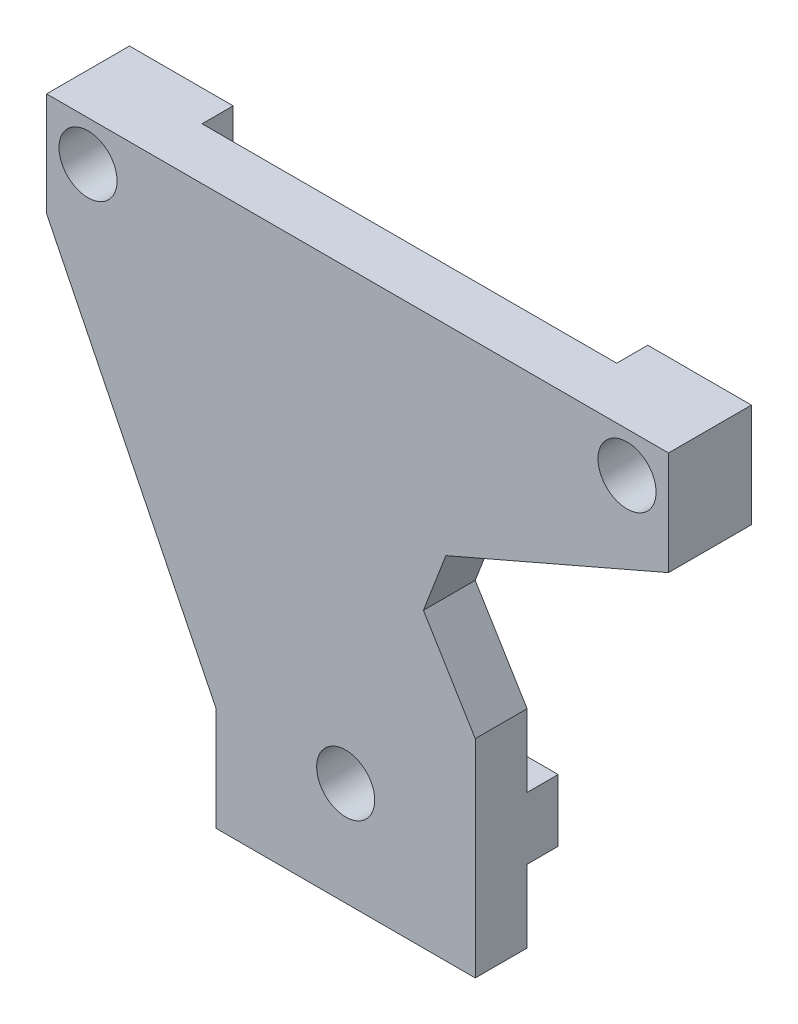
ISO-10303-21;
HEADER;
FILE_DESCRIPTION(('STEP AP214'),'2;1');
FILE_NAME('part.step','',(''),(''),'','','');
FILE_SCHEMA(('AUTOMOTIVE_DESIGN { 1 0 10303 214 1 1 1 1 }'));
ENDSEC;
DATA;
#1=APPLICATION_CONTEXT('core data for automotive mechanical design processes');
#2=APPLICATION_PROTOCOL_DEFINITION('international standard','automotive_design',2000,#1);
#3=PRODUCT_CONTEXT('',#1,'mechanical');
#4=PRODUCT('Part','Part','',(#3));
#5=PRODUCT_RELATED_PRODUCT_CATEGORY('part','',(#4));
#6=PRODUCT_DEFINITION_FORMATION('','',#4);
#7=PRODUCT_DEFINITION_CONTEXT('part definition',#1,'design');
#8=PRODUCT_DEFINITION('design','',#6,#7);
#9=PRODUCT_DEFINITION_SHAPE('','',#8);
#10=(LENGTH_UNIT() NAMED_UNIT(*) SI_UNIT(.MILLI.,.METRE.));
#11=(NAMED_UNIT(*) PLANE_ANGLE_UNIT() SI_UNIT($,.RADIAN.));
#12=(NAMED_UNIT(*) SI_UNIT($,.STERADIAN.) SOLID_ANGLE_UNIT());
#13=UNCERTAINTY_MEASURE_WITH_UNIT(LENGTH_MEASURE(1.E-05),#10,'distance_accuracy_value','');
#14=(GEOMETRIC_REPRESENTATION_CONTEXT(3) GLOBAL_UNCERTAINTY_ASSIGNED_CONTEXT((#13)) GLOBAL_UNIT_ASSIGNED_CONTEXT((#10,
#11,#12)) REPRESENTATION_CONTEXT('',''));
#15=CARTESIAN_POINT('',(0.,0.,0.));
#16=DIRECTION('',(0.,0.,1.));
#17=DIRECTION('',(1.,0.,0.));
#18=AXIS2_PLACEMENT_3D('',#15,#16,#17);
#19=CARTESIAN_POINT('',(0.,0.,0.));
#20=DIRECTION('',(0.,0.,1.));
#21=DIRECTION('',(1.,0.,0.));
#22=AXIS2_PLACEMENT_3D('',#19,#20,#21);
#23=PLANE('',#22);
#24=DIRECTION('',(0.442079053201817,-0.896976092613502,0.));
#25=VECTOR('',#24,1.);
#26=CARTESIAN_POINT('',(0.,-10.,0.));
#27=LINE('',#26,#25);
#28=CARTESIAN_POINT('',(0.,-10.,0.));
#29=VERTEX_POINT('',#28);
#30=CARTESIAN_POINT('',(16.3569249684672,-43.1881154266996,0.));
#31=VERTEX_POINT('',#30);
#32=EDGE_CURVE('E155',#29,#31,#27,.T.);
#33=ORIENTED_EDGE('',*,*,#32,.F.);
#34=DIRECTION('',(1.,0.,0.));
#35=VECTOR('',#34,1.);
#36=CARTESIAN_POINT('',(0.,-10.,0.));
#37=LINE('',#36,#35);
#38=CARTESIAN_POINT('',(10.,-10.,0.));
#39=VERTEX_POINT('',#38);
#40=EDGE_CURVE('E227',#29,#39,#37,.T.);
#41=ORIENTED_EDGE('',*,*,#40,.T.);
#42=DIRECTION('',(0.,-1.,0.));
#43=VECTOR('',#42,1.);
#44=CARTESIAN_POINT('',(10.,0.,0.));
#45=LINE('',#44,#43);
#46=CARTESIAN_POINT('',(10.,0.,0.));
#47=VERTEX_POINT('',#46);
#48=EDGE_CURVE('E465',#47,#39,#45,.T.);
#49=ORIENTED_EDGE('',*,*,#48,.F.);
#50=DIRECTION('',(-1.,0.,0.));
#51=VECTOR('',#50,1.);
#52=CARTESIAN_POINT('',(0.,0.,0.));
#53=LINE('',#52,#51);
#54=CARTESIAN_POINT('',(50.,0.,0.));
#55=VERTEX_POINT('',#54);
#56=EDGE_CURVE('E178',#55,#47,#53,.T.);
#57=ORIENTED_EDGE('',*,*,#56,.F.);
#58=DIRECTION('',(0.,-1.,0.));
#59=VECTOR('',#58,1.);
#60=CARTESIAN_POINT('',(50.,0.,0.));
#61=LINE('',#60,#59);
#62=CARTESIAN_POINT('',(50.,-10.,0.));
#63=VERTEX_POINT('',#62);
#64=EDGE_CURVE('E348',#55,#63,#61,.T.);
#65=ORIENTED_EDGE('',*,*,#64,.T.);
#66=DIRECTION('',(-1.,0.,0.));
#67=VECTOR('',#66,1.);
#68=CARTESIAN_POINT('',(60.,-10.,0.));
#69=LINE('',#68,#67);
#70=CARTESIAN_POINT('',(60.,-10.,0.));
#71=VERTEX_POINT('',#70);
#72=EDGE_CURVE('E301',#71,#63,#69,.T.);
#73=ORIENTED_EDGE('',*,*,#72,.F.);
#74=DIRECTION('',(0.917432042877984,0.397892506464659,0.));
#75=VECTOR('',#74,1.);
#76=CARTESIAN_POINT('',(38.5227399227401,-19.3147398877922,0.));
#77=LINE('',#76,#75);
#78=CARTESIAN_POINT('',(38.5227399227401,-19.3147398877922,0.));
#79=VERTEX_POINT('',#78);
#80=EDGE_CURVE('E138',#79,#71,#77,.T.);
#81=ORIENTED_EDGE('',*,*,#80,.F.);
#82=DIRECTION('',(0.357936011632452,0.93374611730205,0.));
#83=VECTOR('',#82,1.);
#84=CARTESIAN_POINT('',(36.3557169880903,-24.9678431955744,0.));
#85=LINE('',#84,#83);
#86=CARTESIAN_POINT('',(36.3557169880903,-24.9678431955744,0.));
#87=VERTEX_POINT('',#86);
#88=EDGE_CURVE('E92',#87,#79,#85,.T.);
#89=ORIENTED_EDGE('',*,*,#88,.F.);
#90=DIRECTION('',(-0.519762211169417,0.854310976073864,0.));
#91=VECTOR('',#90,1.);
#92=CARTESIAN_POINT('',(41.3569249684672,-33.1881154266996,0.));
#93=LINE('',#92,#91);
#94=CARTESIAN_POINT('',(41.3569249684672,-33.1881154266996,0.));
#95=VERTEX_POINT('',#94);
#96=EDGE_CURVE('E171',#95,#87,#93,.T.);
#97=ORIENTED_EDGE('',*,*,#96,.F.);
#98=DIRECTION('',(0.,1.,0.));
#99=VECTOR('',#98,1.);
#100=CARTESIAN_POINT('',(41.3569249684672,-53.1881154266996,0.));
#101=LINE('',#100,#99);
#102=CARTESIAN_POINT('',(41.3569249684672,-40.1881154266996,0.));
#103=VERTEX_POINT('',#102);
#104=EDGE_CURVE('E166',#103,#95,#101,.T.);
#105=ORIENTED_EDGE('',*,*,#104,.F.);
#106=DIRECTION('',(-1.,0.,0.));
#107=VECTOR('',#106,1.);
#108=CARTESIAN_POINT('',(41.3569249684672,-40.1881154266996,0.));
#109=LINE('',#108,#107);
#110=CARTESIAN_POINT('',(16.3569249684672,-40.1881154266996,0.));
#111=VERTEX_POINT('',#110);
#112=EDGE_CURVE('E374',#103,#111,#109,.T.);
#113=ORIENTED_EDGE('',*,*,#112,.T.);
#114=DIRECTION('',(0.,-1.,0.));
#115=VECTOR('',#114,1.);
#116=CARTESIAN_POINT('',(16.3569249684672,-40.1881154266996,0.));
#117=LINE('',#116,#115);
#118=EDGE_CURVE('E213',#111,#31,#117,.T.);
#119=ORIENTED_EDGE('',*,*,#118,.T.);
#120=EDGE_LOOP('',(#33,#41,#49,#57,#65,#73,#81,#89,#97,#105,#113,#119));
#121=FACE_BOUND('',#120,.T.);
#122=ADVANCED_FACE('F42',(#121),#23,.F.);
#123=DIRECTION('',(-1.,0.,0.));
#124=VECTOR('',#123,1.);
#125=CARTESIAN_POINT('',(41.3569249684672,-46.1881154266996,0.));
#126=LINE('',#125,#124);
#127=CARTESIAN_POINT('',(41.3569249684672,-46.1881154266996,0.));
#128=VERTEX_POINT('',#127);
#129=CARTESIAN_POINT('',(16.3569249684672,-46.1881154266996,0.));
#130=VERTEX_POINT('',#129);
#131=EDGE_CURVE('E58',#128,#130,#126,.T.);
#132=ORIENTED_EDGE('',*,*,#131,.F.);
#133=CARTESIAN_POINT('',(41.3569249684672,-53.1881154266996,0.));
#134=VERTEX_POINT('',#133);
#135=EDGE_CURVE('E167',#134,#128,#101,.T.);
#136=ORIENTED_EDGE('',*,*,#135,.F.);
#137=DIRECTION('',(1.,0.,0.));
#138=VECTOR('',#137,1.);
#139=CARTESIAN_POINT('',(16.3569249684672,-53.1881154266996,0.));
#140=LINE('',#139,#138);
#141=CARTESIAN_POINT('',(16.3569249684672,-53.1881154266996,0.));
#142=VERTEX_POINT('',#141);
#143=EDGE_CURVE('E163',#142,#134,#140,.T.);
#144=ORIENTED_EDGE('',*,*,#143,.F.);
#145=DIRECTION('',(0.,-1.,0.));
#146=VECTOR('',#145,1.);
#147=CARTESIAN_POINT('',(16.3569249684672,-43.1881154266996,0.));
#148=LINE('',#147,#146);
#149=EDGE_CURVE('E159',#130,#142,#148,.T.);
#150=ORIENTED_EDGE('',*,*,#149,.F.);
#151=EDGE_LOOP('',(#132,#136,#144,#150));
#152=FACE_BOUND('',#151,.T.);
#153=ADVANCED_FACE('F298',(#152),#23,.F.);
#154=CARTESIAN_POINT('',(0.,0.,5.));
#155=DIRECTION('',(1.,0.,0.));
#156=DIRECTION('',(0.,0.,-1.));
#157=AXIS2_PLACEMENT_3D('',#154,#155,#156);
#158=PLANE('',#157);
#159=DIRECTION('',(0.,0.,-1.));
#160=VECTOR('',#159,1.);
#161=CARTESIAN_POINT('',(0.,0.,5.));
#162=LINE('',#161,#160);
#163=CARTESIAN_POINT('',(0.,0.,5.));
#164=VERTEX_POINT('',#163);
#165=CARTESIAN_POINT('',(0.,0.,-3.));
#166=VERTEX_POINT('',#165);
#167=EDGE_CURVE('E151',#164,#166,#162,.T.);
#168=ORIENTED_EDGE('',*,*,#167,.T.);
#169=DIRECTION('',(0.,-1.,0.));
#170=VECTOR('',#169,1.);
#171=CARTESIAN_POINT('',(0.,0.,-3.));
#172=LINE('',#171,#170);
#173=CARTESIAN_POINT('',(0.,-10.,-3.));
#174=VERTEX_POINT('',#173);
#175=EDGE_CURVE('E440',#166,#174,#172,.T.);
#176=ORIENTED_EDGE('',*,*,#175,.T.);
#177=DIRECTION('',(0.,0.,1.));
#178=VECTOR('',#177,1.);
#179=CARTESIAN_POINT('',(0.,-10.,-3.));
#180=LINE('',#179,#178);
#181=EDGE_CURVE('E235',#174,#29,#180,.T.);
#182=ORIENTED_EDGE('',*,*,#181,.T.);
#183=DIRECTION('',(0.,0.,-1.));
#184=VECTOR('',#183,1.);
#185=CARTESIAN_POINT('',(0.,-10.,5.));
#186=LINE('',#185,#184);
#187=CARTESIAN_POINT('',(0.,-10.,5.));
#188=VERTEX_POINT('',#187);
#189=EDGE_CURVE('E12',#188,#29,#186,.T.);
#190=ORIENTED_EDGE('',*,*,#189,.F.);
#191=DIRECTION('',(0.,-1.,0.));
#192=VECTOR('',#191,1.);
#193=CARTESIAN_POINT('',(0.,0.,5.));
#194=LINE('',#193,#192);
#195=EDGE_CURVE('E182',#164,#188,#194,.T.);
#196=ORIENTED_EDGE('',*,*,#195,.F.);
#197=EDGE_LOOP('',(#168,#176,#182,#190,#196));
#198=FACE_BOUND('',#197,.T.);
#199=ADVANCED_FACE('F44',(#198),#158,.F.);
#200=CARTESIAN_POINT('',(0.,-10.,5.));
#201=DIRECTION('',(0.896976092613502,0.442079053201817,0.));
#202=DIRECTION('',(-0.442079053201817,0.896976092613502,0.));
#203=AXIS2_PLACEMENT_3D('',#200,#201,#202);
#204=PLANE('',#203);
#205=ORIENTED_EDGE('',*,*,#32,.T.);
#206=DIRECTION('',(0.,0.,-1.));
#207=VECTOR('',#206,1.);
#208=CARTESIAN_POINT('',(16.3569249684672,-43.1881154266996,5.));
#209=LINE('',#208,#207);
#210=CARTESIAN_POINT('',(16.3569249684672,-43.1881154266996,5.));
#211=VERTEX_POINT('',#210);
#212=EDGE_CURVE('E51',#211,#31,#209,.T.);
#213=ORIENTED_EDGE('',*,*,#212,.F.);
#214=DIRECTION('',(0.442079053201817,-0.896976092613502,0.));
#215=VECTOR('',#214,1.);
#216=CARTESIAN_POINT('',(0.,-10.,5.));
#217=LINE('',#216,#215);
#218=EDGE_CURVE('E100',#188,#211,#217,.T.);
#219=ORIENTED_EDGE('',*,*,#218,.F.);
#220=ORIENTED_EDGE('',*,*,#189,.T.);
#221=EDGE_LOOP('',(#205,#213,#219,#220));
#222=FACE_BOUND('',#221,.T.);
#223=ADVANCED_FACE('F218',(#222),#204,.F.);
#224=CARTESIAN_POINT('',(16.3569249684672,-43.1881154266996,5.));
#225=DIRECTION('',(1.,0.,0.));
#226=DIRECTION('',(0.,0.,-1.));
#227=AXIS2_PLACEMENT_3D('',#224,#225,#226);
#228=PLANE('',#227);
#229=ORIENTED_EDGE('',*,*,#212,.T.);
#230=ORIENTED_EDGE('',*,*,#118,.F.);
#231=DIRECTION('',(0.,0.,1.));
#232=VECTOR('',#231,1.);
#233=CARTESIAN_POINT('',(16.3569249684672,-40.1881154266996,-3.));
#234=LINE('',#233,#232);
#235=CARTESIAN_POINT('',(16.3569249684672,-40.1881154266996,-3.));
#236=VERTEX_POINT('',#235);
#237=EDGE_CURVE('E316',#236,#111,#234,.T.);
#238=ORIENTED_EDGE('',*,*,#237,.F.);
#239=DIRECTION('',(0.,-1.,0.));
#240=VECTOR('',#239,1.);
#241=CARTESIAN_POINT('',(16.3569249684672,-40.1881154266996,-3.));
#242=LINE('',#241,#240);
#243=CARTESIAN_POINT('',(16.3569249684672,-46.1881154266996,-3.));
#244=VERTEX_POINT('',#243);
#245=EDGE_CURVE('E314',#236,#244,#242,.T.);
#246=ORIENTED_EDGE('',*,*,#245,.T.);
#247=DIRECTION('',(0.,0.,1.));
#248=VECTOR('',#247,1.);
#249=CARTESIAN_POINT('',(16.3569249684672,-46.1881154266996,-3.));
#250=LINE('',#249,#248);
#251=EDGE_CURVE('E160',#244,#130,#250,.T.);
#252=ORIENTED_EDGE('',*,*,#251,.T.);
#253=ORIENTED_EDGE('',*,*,#149,.T.);
#254=DIRECTION('',(0.,0.,-1.));
#255=VECTOR('',#254,1.);
#256=CARTESIAN_POINT('',(16.3569249684672,-53.1881154266996,5.));
#257=LINE('',#256,#255);
#258=CARTESIAN_POINT('',(16.3569249684672,-53.1881154266996,5.));
#259=VERTEX_POINT('',#258);
#260=EDGE_CURVE('E201',#259,#142,#257,.T.);
#261=ORIENTED_EDGE('',*,*,#260,.F.);
#262=DIRECTION('',(0.,-1.,0.));
#263=VECTOR('',#262,1.);
#264=CARTESIAN_POINT('',(16.3569249684672,-43.1881154266996,5.));
#265=LINE('',#264,#263);
#266=EDGE_CURVE('E216',#211,#259,#265,.T.);
#267=ORIENTED_EDGE('',*,*,#266,.F.);
#268=EDGE_LOOP('',(#229,#230,#238,#246,#252,#253,#261,#267));
#269=FACE_BOUND('',#268,.T.);
#270=ADVANCED_FACE('F209',(#269),#228,.F.);
#271=CARTESIAN_POINT('',(16.3569249684672,-53.1881154266996,5.));
#272=DIRECTION('',(0.,1.,0.));
#273=DIRECTION('',(0.,0.,1.));
#274=AXIS2_PLACEMENT_3D('',#271,#272,#273);
#275=PLANE('',#274);
#276=ORIENTED_EDGE('',*,*,#143,.T.);
#277=DIRECTION('',(0.,0.,-1.));
#278=VECTOR('',#277,1.);
#279=CARTESIAN_POINT('',(41.3569249684672,-53.1881154266996,5.));
#280=LINE('',#279,#278);
#281=CARTESIAN_POINT('',(41.3569249684672,-53.1881154266996,5.));
#282=VERTEX_POINT('',#281);
#283=EDGE_CURVE('E197',#282,#134,#280,.T.);
#284=ORIENTED_EDGE('',*,*,#283,.F.);
#285=DIRECTION('',(1.,0.,0.));
#286=VECTOR('',#285,1.);
#287=CARTESIAN_POINT('',(16.3569249684672,-53.1881154266996,5.));
#288=LINE('',#287,#286);
#289=EDGE_CURVE('E311',#259,#282,#288,.T.);
#290=ORIENTED_EDGE('',*,*,#289,.F.);
#291=ORIENTED_EDGE('',*,*,#260,.T.);
#292=EDGE_LOOP('',(#276,#284,#290,#291));
#293=FACE_BOUND('',#292,.T.);
#294=ADVANCED_FACE('F310',(#293),#275,.F.);
#295=CARTESIAN_POINT('',(41.3569249684672,-53.1881154266996,5.));
#296=DIRECTION('',(-1.,0.,0.));
#297=DIRECTION('',(0.,0.,1.));
#298=AXIS2_PLACEMENT_3D('',#295,#296,#297);
#299=PLANE('',#298);
#300=ORIENTED_EDGE('',*,*,#135,.T.);
#301=DIRECTION('',(0.,0.,1.));
#302=VECTOR('',#301,1.);
#303=CARTESIAN_POINT('',(41.3569249684672,-46.1881154266996,-3.));
#304=LINE('',#303,#302);
#305=CARTESIAN_POINT('',(41.3569249684672,-46.1881154266996,-3.));
#306=VERTEX_POINT('',#305);
#307=EDGE_CURVE('E286',#306,#128,#304,.T.);
#308=ORIENTED_EDGE('',*,*,#307,.F.);
#309=DIRECTION('',(0.,-1.,0.));
#310=VECTOR('',#309,1.);
#311=CARTESIAN_POINT('',(41.3569249684672,-40.1881154266996,-3.));
#312=LINE('',#311,#310);
#313=CARTESIAN_POINT('',(41.3569249684672,-40.1881154266996,-3.));
#314=VERTEX_POINT('',#313);
#315=EDGE_CURVE('E293',#314,#306,#312,.T.);
#316=ORIENTED_EDGE('',*,*,#315,.F.);
#317=DIRECTION('',(0.,0.,1.));
#318=VECTOR('',#317,1.);
#319=CARTESIAN_POINT('',(41.3569249684672,-40.1881154266996,-3.));
#320=LINE('',#319,#318);
#321=EDGE_CURVE('E292',#314,#103,#320,.T.);
#322=ORIENTED_EDGE('',*,*,#321,.T.);
#323=ORIENTED_EDGE('',*,*,#104,.T.);
#324=DIRECTION('',(0.,0.,-1.));
#325=VECTOR('',#324,1.);
#326=CARTESIAN_POINT('',(41.3569249684672,-33.1881154266996,5.));
#327=LINE('',#326,#325);
#328=CARTESIAN_POINT('',(41.3569249684672,-33.1881154266996,5.));
#329=VERTEX_POINT('',#328);
#330=EDGE_CURVE('E193',#329,#95,#327,.T.);
#331=ORIENTED_EDGE('',*,*,#330,.F.);
#332=DIRECTION('',(0.,1.,0.));
#333=VECTOR('',#332,1.);
#334=CARTESIAN_POINT('',(41.3569249684672,-53.1881154266996,5.));
#335=LINE('',#334,#333);
#336=EDGE_CURVE('E307',#282,#329,#335,.T.);
#337=ORIENTED_EDGE('',*,*,#336,.F.);
#338=ORIENTED_EDGE('',*,*,#283,.T.);
#339=EDGE_LOOP('',(#300,#308,#316,#322,#323,#331,#337,#338));
#340=FACE_BOUND('',#339,.T.);
#341=ADVANCED_FACE('F303',(#340),#299,.F.);
#342=CARTESIAN_POINT('',(41.3569249684672,-33.1881154266996,5.));
#343=DIRECTION('',(-0.854310976073864,-0.519762211169417,0.));
#344=DIRECTION('',(0.519762211169417,-0.854310976073864,0.));
#345=AXIS2_PLACEMENT_3D('',#342,#343,#344);
#346=PLANE('',#345);
#347=ORIENTED_EDGE('',*,*,#96,.T.);
#348=DIRECTION('',(0.,0.,-1.));
#349=VECTOR('',#348,1.);
#350=CARTESIAN_POINT('',(36.3557169880903,-24.9678431955744,5.));
#351=LINE('',#350,#349);
#352=CARTESIAN_POINT('',(36.3557169880903,-24.9678431955744,5.));
#353=VERTEX_POINT('',#352);
#354=EDGE_CURVE('E190',#353,#87,#351,.T.);
#355=ORIENTED_EDGE('',*,*,#354,.F.);
#356=DIRECTION('',(-0.519762211169417,0.854310976073864,0.));
#357=VECTOR('',#356,1.);
#358=CARTESIAN_POINT('',(41.3569249684672,-33.1881154266996,5.));
#359=LINE('',#358,#357);
#360=EDGE_CURVE('E332',#329,#353,#359,.T.);
#361=ORIENTED_EDGE('',*,*,#360,.F.);
#362=ORIENTED_EDGE('',*,*,#330,.T.);
#363=EDGE_LOOP('',(#347,#355,#361,#362));
#364=FACE_BOUND('',#363,.T.);
#365=ADVANCED_FACE('F341',(#364),#346,.F.);
#366=CARTESIAN_POINT('',(36.3557169880903,-24.9678431955744,5.));
#367=DIRECTION('',(-0.93374611730205,0.357936011632452,0.));
#368=DIRECTION('',(-0.357936011632452,-0.93374611730205,0.));
#369=AXIS2_PLACEMENT_3D('',#366,#367,#368);
#370=PLANE('',#369);
#371=ORIENTED_EDGE('',*,*,#88,.T.);
#372=DIRECTION('',(0.,0.,-1.));
#373=VECTOR('',#372,1.);
#374=CARTESIAN_POINT('',(38.5227399227401,-19.3147398877922,5.));
#375=LINE('',#374,#373);
#376=CARTESIAN_POINT('',(38.5227399227401,-19.3147398877922,5.));
#377=VERTEX_POINT('',#376);
#378=EDGE_CURVE('E142',#377,#79,#375,.T.);
#379=ORIENTED_EDGE('',*,*,#378,.F.);
#380=DIRECTION('',(0.357936011632452,0.93374611730205,0.));
#381=VECTOR('',#380,1.);
#382=CARTESIAN_POINT('',(36.3557169880903,-24.9678431955744,5.));
#383=LINE('',#382,#381);
#384=EDGE_CURVE('E128',#353,#377,#383,.T.);
#385=ORIENTED_EDGE('',*,*,#384,.F.);
#386=ORIENTED_EDGE('',*,*,#354,.T.);
#387=EDGE_LOOP('',(#371,#379,#385,#386));
#388=FACE_BOUND('',#387,.T.);
#389=ADVANCED_FACE('F421',(#388),#370,.F.);
#390=CARTESIAN_POINT('',(38.5227399227401,-19.3147398877922,5.));
#391=DIRECTION('',(-0.397892506464658,0.917432042877984,0.));
#392=DIRECTION('',(-0.917432042877985,-0.397892506464659,0.));
#393=AXIS2_PLACEMENT_3D('',#390,#391,#392);
#394=PLANE('',#393);
#395=ORIENTED_EDGE('',*,*,#80,.T.);
#396=DIRECTION('',(0.,0.,-1.));
#397=VECTOR('',#396,1.);
#398=CARTESIAN_POINT('',(60.,-10.,5.));
#399=LINE('',#398,#397);
#400=CARTESIAN_POINT('',(60.,-10.,5.));
#401=VERTEX_POINT('',#400);
#402=EDGE_CURVE('E134',#401,#71,#399,.T.);
#403=ORIENTED_EDGE('',*,*,#402,.F.);
#404=DIRECTION('',(0.917432042877984,0.397892506464659,0.));
#405=VECTOR('',#404,1.);
#406=CARTESIAN_POINT('',(38.5227399227401,-19.3147398877922,5.));
#407=LINE('',#406,#405);
#408=EDGE_CURVE('E121',#377,#401,#407,.T.);
#409=ORIENTED_EDGE('',*,*,#408,.F.);
#410=ORIENTED_EDGE('',*,*,#378,.T.);
#411=EDGE_LOOP('',(#395,#403,#409,#410));
#412=FACE_BOUND('',#411,.T.);
#413=ADVANCED_FACE('F135',(#412),#394,.F.);
#414=CARTESIAN_POINT('',(60.,0.,5.));
#415=DIRECTION('',(-1.,0.,0.));
#416=DIRECTION('',(0.,0.,1.));
#417=AXIS2_PLACEMENT_3D('',#414,#415,#416);
#418=PLANE('',#417);
#419=ORIENTED_EDGE('',*,*,#402,.T.);
#420=DIRECTION('',(0.,0.,1.));
#421=VECTOR('',#420,1.);
#422=CARTESIAN_POINT('',(60.,-10.,-3.));
#423=LINE('',#422,#421);
#424=CARTESIAN_POINT('',(60.,-10.,-3.));
#425=VERTEX_POINT('',#424);
#426=EDGE_CURVE('E362',#425,#71,#423,.T.);
#427=ORIENTED_EDGE('',*,*,#426,.F.);
#428=DIRECTION('',(0.,-1.,0.));
#429=VECTOR('',#428,1.);
#430=CARTESIAN_POINT('',(60.,0.,-3.));
#431=LINE('',#430,#429);
#432=CARTESIAN_POINT('',(60.,0.,-3.));
#433=VERTEX_POINT('',#432);
#434=EDGE_CURVE('E358',#433,#425,#431,.T.);
#435=ORIENTED_EDGE('',*,*,#434,.F.);
#436=DIRECTION('',(0.,0.,-1.));
#437=VECTOR('',#436,1.);
#438=CARTESIAN_POINT('',(60.,0.,5.));
#439=LINE('',#438,#437);
#440=CARTESIAN_POINT('',(60.,0.,5.));
#441=VERTEX_POINT('',#440);
#442=EDGE_CURVE('E143',#441,#433,#439,.T.);
#443=ORIENTED_EDGE('',*,*,#442,.F.);
#444=DIRECTION('',(0.,1.,0.));
#445=VECTOR('',#444,1.);
#446=CARTESIAN_POINT('',(60.,0.,5.));
#447=LINE('',#446,#445);
#448=EDGE_CURVE('E125',#401,#441,#447,.T.);
#449=ORIENTED_EDGE('',*,*,#448,.F.);
#450=EDGE_LOOP('',(#419,#427,#435,#443,#449));
#451=FACE_BOUND('',#450,.T.);
#452=ADVANCED_FACE('F145',(#451),#418,.F.);
#453=CARTESIAN_POINT('',(0.,0.,5.));
#454=DIRECTION('',(0.,-1.,0.));
#455=DIRECTION('',(0.,0.,-1.));
#456=AXIS2_PLACEMENT_3D('',#453,#454,#455);
#457=PLANE('',#456);
#458=ORIENTED_EDGE('',*,*,#442,.T.);
#459=DIRECTION('',(-1.,0.,0.));
#460=VECTOR('',#459,1.);
#461=CARTESIAN_POINT('',(60.,0.,-3.));
#462=LINE('',#461,#460);
#463=CARTESIAN_POINT('',(50.,0.,-3.));
#464=VERTEX_POINT('',#463);
#465=EDGE_CURVE('E361',#433,#464,#462,.T.);
#466=ORIENTED_EDGE('',*,*,#465,.T.);
#467=DIRECTION('',(0.,0.,1.));
#468=VECTOR('',#467,1.);
#469=CARTESIAN_POINT('',(50.,0.,-3.));
#470=LINE('',#469,#468);
#471=EDGE_CURVE('E469',#464,#55,#470,.T.);
#472=ORIENTED_EDGE('',*,*,#471,.T.);
#473=ORIENTED_EDGE('',*,*,#56,.T.);
#474=DIRECTION('',(0.,0.,1.));
#475=VECTOR('',#474,1.);
#476=CARTESIAN_POINT('',(10.,0.,-3.));
#477=LINE('',#476,#475);
#478=CARTESIAN_POINT('',(10.,0.,-3.));
#479=VERTEX_POINT('',#478);
#480=EDGE_CURVE('E443',#479,#47,#477,.T.);
#481=ORIENTED_EDGE('',*,*,#480,.F.);
#482=DIRECTION('',(1.,0.,0.));
#483=VECTOR('',#482,1.);
#484=CARTESIAN_POINT('',(0.,0.,-3.));
#485=LINE('',#484,#483);
#486=EDGE_CURVE('E442',#166,#479,#485,.T.);
#487=ORIENTED_EDGE('',*,*,#486,.F.);
#488=ORIENTED_EDGE('',*,*,#167,.F.);
#489=DIRECTION('',(-1.,0.,0.));
#490=VECTOR('',#489,1.);
#491=CARTESIAN_POINT('',(0.,0.,5.));
#492=LINE('',#491,#490);
#493=EDGE_CURVE('E67',#441,#164,#492,.T.);
#494=ORIENTED_EDGE('',*,*,#493,.F.);
#495=EDGE_LOOP('',(#458,#466,#472,#473,#481,#487,#488,#494));
#496=FACE_BOUND('',#495,.T.);
#497=ADVANCED_FACE('F413',(#496),#457,.F.);
#498=CARTESIAN_POINT('',(0.,0.,5.));
#499=DIRECTION('',(0.,0.,1.));
#500=DIRECTION('',(1.,0.,0.));
#501=AXIS2_PLACEMENT_3D('',#498,#499,#500);
#502=PLANE('',#501);
#503=CARTESIAN_POINT('',(56.,-3.88,5.));
#504=DIRECTION('',(0.,0.,1.));
#505=DIRECTION('',(1.,0.,0.));
#506=AXIS2_PLACEMENT_3D('',#503,#504,#505);
#507=CIRCLE('',#506,2.8);
#508=CARTESIAN_POINT('',(58.8,-3.88,5.));
#509=VERTEX_POINT('',#508);
#510=EDGE_CURVE('E492',#509,#509,#507,.T.);
#511=ORIENTED_EDGE('',*,*,#510,.F.);
#512=EDGE_LOOP('',(#511));
#513=FACE_BOUND('',#512,.T.);
#514=CARTESIAN_POINT('',(4.,-3.88,5.));
#515=DIRECTION('',(0.,0.,1.));
#516=DIRECTION('',(1.,0.,0.));
#517=AXIS2_PLACEMENT_3D('',#514,#515,#516);
#518=CIRCLE('',#517,2.8);
#519=CARTESIAN_POINT('',(6.8,-3.88,5.));
#520=VERTEX_POINT('',#519);
#521=EDGE_CURVE('E496',#520,#520,#518,.T.);
#522=ORIENTED_EDGE('',*,*,#521,.F.);
#523=EDGE_LOOP('',(#522));
#524=FACE_BOUND('',#523,.T.);
#525=CARTESIAN_POINT('',(28.8569249684672,-43.1881154266996,5.));
#526=DIRECTION('',(0.,0.,1.));
#527=DIRECTION('',(1.,0.,0.));
#528=AXIS2_PLACEMENT_3D('',#525,#526,#527);
#529=CIRCLE('',#528,2.8);
#530=CARTESIAN_POINT('',(31.6569249684672,-43.1881154266996,5.));
#531=VERTEX_POINT('',#530);
#532=EDGE_CURVE('E486',#531,#531,#529,.T.);
#533=ORIENTED_EDGE('',*,*,#532,.F.);
#534=EDGE_LOOP('',(#533));
#535=FACE_BOUND('',#534,.T.);
#536=ORIENTED_EDGE('',*,*,#195,.T.);
#537=ORIENTED_EDGE('',*,*,#218,.T.);
#538=ORIENTED_EDGE('',*,*,#266,.T.);
#539=ORIENTED_EDGE('',*,*,#289,.T.);
#540=ORIENTED_EDGE('',*,*,#336,.T.);
#541=ORIENTED_EDGE('',*,*,#360,.T.);
#542=ORIENTED_EDGE('',*,*,#384,.T.);
#543=ORIENTED_EDGE('',*,*,#408,.T.);
#544=ORIENTED_EDGE('',*,*,#448,.T.);
#545=ORIENTED_EDGE('',*,*,#493,.T.);
#546=EDGE_LOOP('',(#536,#537,#538,#539,#540,#541,#542,#543,#544,#545));
#547=FACE_BOUND('',#546,.T.);
#548=ADVANCED_FACE('F123',(#513,#524,#535,#547),#502,.T.);
#549=CARTESIAN_POINT('',(41.3569249684672,-46.1881154266996,-3.));
#550=DIRECTION('',(0.,1.,0.));
#551=DIRECTION('',(0.,0.,1.));
#552=AXIS2_PLACEMENT_3D('',#549,#550,#551);
#553=PLANE('',#552);
#554=ORIENTED_EDGE('',*,*,#131,.T.);
#555=ORIENTED_EDGE('',*,*,#251,.F.);
#556=DIRECTION('',(-1.,0.,0.));
#557=VECTOR('',#556,1.);
#558=CARTESIAN_POINT('',(41.3569249684672,-46.1881154266996,-3.));
#559=LINE('',#558,#557);
#560=EDGE_CURVE('E288',#306,#244,#559,.T.);
#561=ORIENTED_EDGE('',*,*,#560,.F.);
#562=ORIENTED_EDGE('',*,*,#307,.T.);
#563=EDGE_LOOP('',(#554,#555,#561,#562));
#564=FACE_BOUND('',#563,.T.);
#565=ADVANCED_FACE('F287',(#564),#553,.F.);
#566=CARTESIAN_POINT('',(41.3569249684672,-40.1881154266996,-3.));
#567=DIRECTION('',(0.,1.,0.));
#568=DIRECTION('',(0.,0.,1.));
#569=AXIS2_PLACEMENT_3D('',#566,#567,#568);
#570=PLANE('',#569);
#571=ORIENTED_EDGE('',*,*,#112,.F.);
#572=ORIENTED_EDGE('',*,*,#321,.F.);
#573=DIRECTION('',(-1.,0.,0.));
#574=VECTOR('',#573,1.);
#575=CARTESIAN_POINT('',(41.3569249684672,-40.1881154266996,-3.));
#576=LINE('',#575,#574);
#577=EDGE_CURVE('E377',#314,#236,#576,.T.);
#578=ORIENTED_EDGE('',*,*,#577,.T.);
#579=ORIENTED_EDGE('',*,*,#237,.T.);
#580=EDGE_LOOP('',(#571,#572,#578,#579));
#581=FACE_BOUND('',#580,.T.);
#582=ADVANCED_FACE('F388',(#581),#570,.T.);
#583=CARTESIAN_POINT('',(0.,0.,-3.));
#584=DIRECTION('',(0.,0.,1.));
#585=DIRECTION('',(1.,0.,0.));
#586=AXIS2_PLACEMENT_3D('',#583,#584,#585);
#587=PLANE('',#586);
#588=CARTESIAN_POINT('',(28.8569249684672,-43.1881154266996,-3.));
#589=DIRECTION('',(0.,0.,-1.));
#590=DIRECTION('',(-1.,0.,0.));
#591=AXIS2_PLACEMENT_3D('',#588,#589,#590);
#592=CIRCLE('',#591,2.8);
#593=CARTESIAN_POINT('',(26.0569249684672,-43.1881154266996,-3.));
#594=VERTEX_POINT('',#593);
#595=EDGE_CURVE('E501',#594,#594,#592,.T.);
#596=ORIENTED_EDGE('',*,*,#595,.F.);
#597=EDGE_LOOP('',(#596));
#598=FACE_BOUND('',#597,.T.);
#599=ORIENTED_EDGE('',*,*,#560,.T.);
#600=ORIENTED_EDGE('',*,*,#245,.F.);
#601=ORIENTED_EDGE('',*,*,#577,.F.);
#602=ORIENTED_EDGE('',*,*,#315,.T.);
#603=EDGE_LOOP('',(#599,#600,#601,#602));
#604=FACE_BOUND('',#603,.T.);
#605=ADVANCED_FACE('F391',(#598,#604),#587,.F.);
#606=CARTESIAN_POINT('',(60.,-10.,-3.));
#607=DIRECTION('',(0.,1.,0.));
#608=DIRECTION('',(0.,0.,1.));
#609=AXIS2_PLACEMENT_3D('',#606,#607,#608);
#610=PLANE('',#609);
#611=ORIENTED_EDGE('',*,*,#72,.T.);
#612=DIRECTION('',(0.,0.,1.));
#613=VECTOR('',#612,1.);
#614=CARTESIAN_POINT('',(50.,-10.,-3.));
#615=LINE('',#614,#613);
#616=CARTESIAN_POINT('',(50.,-10.,-3.));
#617=VERTEX_POINT('',#616);
#618=EDGE_CURVE('E466',#617,#63,#615,.T.);
#619=ORIENTED_EDGE('',*,*,#618,.F.);
#620=DIRECTION('',(-1.,0.,0.));
#621=VECTOR('',#620,1.);
#622=CARTESIAN_POINT('',(60.,-10.,-3.));
#623=LINE('',#622,#621);
#624=EDGE_CURVE('E354',#425,#617,#623,.T.);
#625=ORIENTED_EDGE('',*,*,#624,.F.);
#626=ORIENTED_EDGE('',*,*,#426,.T.);
#627=EDGE_LOOP('',(#611,#619,#625,#626));
#628=FACE_BOUND('',#627,.T.);
#629=ADVANCED_FACE('F393',(#628),#610,.F.);
#630=CARTESIAN_POINT('',(50.,0.,-3.));
#631=DIRECTION('',(-1.,0.,0.));
#632=DIRECTION('',(0.,0.,1.));
#633=AXIS2_PLACEMENT_3D('',#630,#631,#632);
#634=PLANE('',#633);
#635=ORIENTED_EDGE('',*,*,#64,.F.);
#636=ORIENTED_EDGE('',*,*,#471,.F.);
#637=DIRECTION('',(0.,-1.,0.));
#638=VECTOR('',#637,1.);
#639=CARTESIAN_POINT('',(50.,0.,-3.));
#640=LINE('',#639,#638);
#641=EDGE_CURVE('E366',#464,#617,#640,.T.);
#642=ORIENTED_EDGE('',*,*,#641,.T.);
#643=ORIENTED_EDGE('',*,*,#618,.T.);
#644=EDGE_LOOP('',(#635,#636,#642,#643));
#645=FACE_BOUND('',#644,.T.);
#646=ADVANCED_FACE('F400',(#645),#634,.T.);
#647=CARTESIAN_POINT('',(0.,0.,-3.));
#648=DIRECTION('',(0.,0.,1.));
#649=DIRECTION('',(1.,0.,0.));
#650=AXIS2_PLACEMENT_3D('',#647,#648,#649);
#651=PLANE('',#650);
#652=CARTESIAN_POINT('',(56.,-3.88,-3.));
#653=DIRECTION('',(0.,0.,-1.));
#654=DIRECTION('',(-1.,0.,0.));
#655=AXIS2_PLACEMENT_3D('',#652,#653,#654);
#656=CIRCLE('',#655,2.8);
#657=CARTESIAN_POINT('',(53.2,-3.88,-3.));
#658=VERTEX_POINT('',#657);
#659=EDGE_CURVE('E500',#658,#658,#656,.T.);
#660=ORIENTED_EDGE('',*,*,#659,.F.);
#661=EDGE_LOOP('',(#660));
#662=FACE_BOUND('',#661,.T.);
#663=ORIENTED_EDGE('',*,*,#624,.T.);
#664=ORIENTED_EDGE('',*,*,#641,.F.);
#665=ORIENTED_EDGE('',*,*,#465,.F.);
#666=ORIENTED_EDGE('',*,*,#434,.T.);
#667=EDGE_LOOP('',(#663,#664,#665,#666));
#668=FACE_BOUND('',#667,.T.);
#669=ADVANCED_FACE('F476',(#662,#668),#651,.F.);
#670=CARTESIAN_POINT('',(0.,-10.,-3.));
#671=DIRECTION('',(0.,-1.,0.));
#672=DIRECTION('',(1.,0.,0.));
#673=AXIS2_PLACEMENT_3D('',#670,#671,#672);
#674=PLANE('',#673);
#675=ORIENTED_EDGE('',*,*,#40,.F.);
#676=ORIENTED_EDGE('',*,*,#181,.F.);
#677=DIRECTION('',(1.,0.,0.));
#678=VECTOR('',#677,1.);
#679=CARTESIAN_POINT('',(0.,-10.,-3.));
#680=LINE('',#679,#678);
#681=CARTESIAN_POINT('',(10.,-10.,-3.));
#682=VERTEX_POINT('',#681);
#683=EDGE_CURVE('E452',#174,#682,#680,.T.);
#684=ORIENTED_EDGE('',*,*,#683,.T.);
#685=DIRECTION('',(0.,0.,1.));
#686=VECTOR('',#685,1.);
#687=CARTESIAN_POINT('',(10.,-10.,-3.));
#688=LINE('',#687,#686);
#689=EDGE_CURVE('E454',#682,#39,#688,.T.);
#690=ORIENTED_EDGE('',*,*,#689,.T.);
#691=EDGE_LOOP('',(#675,#676,#684,#690));
#692=FACE_BOUND('',#691,.T.);
#693=ADVANCED_FACE('F516',(#692),#674,.T.);
#694=CARTESIAN_POINT('',(10.,0.,-3.));
#695=DIRECTION('',(-1.,0.,0.));
#696=DIRECTION('',(0.,-1.,0.));
#697=AXIS2_PLACEMENT_3D('',#694,#695,#696);
#698=PLANE('',#697);
#699=ORIENTED_EDGE('',*,*,#48,.T.);
#700=ORIENTED_EDGE('',*,*,#689,.F.);
#701=DIRECTION('',(0.,-1.,0.));
#702=VECTOR('',#701,1.);
#703=CARTESIAN_POINT('',(10.,0.,-3.));
#704=LINE('',#703,#702);
#705=EDGE_CURVE('E447',#479,#682,#704,.T.);
#706=ORIENTED_EDGE('',*,*,#705,.F.);
#707=ORIENTED_EDGE('',*,*,#480,.T.);
#708=EDGE_LOOP('',(#699,#700,#706,#707));
#709=FACE_BOUND('',#708,.T.);
#710=ADVANCED_FACE('F521',(#709),#698,.F.);
#711=CARTESIAN_POINT('',(0.,0.,-3.));
#712=DIRECTION('',(0.,0.,-1.));
#713=DIRECTION('',(-1.,0.,0.));
#714=AXIS2_PLACEMENT_3D('',#711,#712,#713);
#715=PLANE('',#714);
#716=CARTESIAN_POINT('',(4.,-3.88,-3.));
#717=DIRECTION('',(0.,0.,-1.));
#718=DIRECTION('',(-1.,0.,0.));
#719=AXIS2_PLACEMENT_3D('',#716,#717,#718);
#720=CIRCLE('',#719,2.8);
#721=CARTESIAN_POINT('',(1.2,-3.88,-3.));
#722=VERTEX_POINT('',#721);
#723=EDGE_CURVE('E505',#722,#722,#720,.T.);
#724=ORIENTED_EDGE('',*,*,#723,.F.);
#725=EDGE_LOOP('',(#724));
#726=FACE_BOUND('',#725,.T.);
#727=ORIENTED_EDGE('',*,*,#683,.F.);
#728=ORIENTED_EDGE('',*,*,#175,.F.);
#729=ORIENTED_EDGE('',*,*,#486,.T.);
#730=ORIENTED_EDGE('',*,*,#705,.T.);
#731=EDGE_LOOP('',(#727,#728,#729,#730));
#732=FACE_BOUND('',#731,.T.);
#733=ADVANCED_FACE('F450',(#726,#732),#715,.T.);
#734=CARTESIAN_POINT('',(4.,-3.88,5.1));
#735=DIRECTION('',(0.,0.,-1.));
#736=DIRECTION('',(-1.,0.,0.));
#737=AXIS2_PLACEMENT_3D('',#734,#735,#736);
#738=CYLINDRICAL_SURFACE('',#737,2.8);
#739=ORIENTED_EDGE('',*,*,#521,.T.);
#740=EDGE_LOOP('',(#739));
#741=FACE_BOUND('',#740,.T.);
#742=ORIENTED_EDGE('',*,*,#723,.T.);
#743=EDGE_LOOP('',(#742));
#744=FACE_BOUND('',#743,.T.);
#745=ADVANCED_FACE('F528',(#741,#744),#738,.F.);
#746=CARTESIAN_POINT('',(56.,-3.88,5.1));
#747=DIRECTION('',(0.,0.,-1.));
#748=DIRECTION('',(-1.,0.,0.));
#749=AXIS2_PLACEMENT_3D('',#746,#747,#748);
#750=CYLINDRICAL_SURFACE('',#749,2.8);
#751=ORIENTED_EDGE('',*,*,#510,.T.);
#752=EDGE_LOOP('',(#751));
#753=FACE_BOUND('',#752,.T.);
#754=ORIENTED_EDGE('',*,*,#659,.T.);
#755=EDGE_LOOP('',(#754));
#756=FACE_BOUND('',#755,.T.);
#757=ADVANCED_FACE('F513',(#753,#756),#750,.F.);
#758=CARTESIAN_POINT('',(28.8569249684672,-43.1881154266996,5.1));
#759=DIRECTION('',(0.,0.,-1.));
#760=DIRECTION('',(-1.,0.,0.));
#761=AXIS2_PLACEMENT_3D('',#758,#759,#760);
#762=CYLINDRICAL_SURFACE('',#761,2.8);
#763=ORIENTED_EDGE('',*,*,#532,.T.);
#764=EDGE_LOOP('',(#763));
#765=FACE_BOUND('',#764,.T.);
#766=ORIENTED_EDGE('',*,*,#595,.T.);
#767=EDGE_LOOP('',(#766));
#768=FACE_BOUND('',#767,.T.);
#769=ADVANCED_FACE('F532',(#765,#768),#762,.F.);
#770=CLOSED_SHELL('',(#122,#153,#199,#223,#270,#294,#341,#365,#389,#413,#452,#497,#548,#565,
#582,#605,#629,#646,#669,#693,#710,#733,#745,#757,#769));
#771=MANIFOLD_SOLID_BREP('B2',#770);
#772=ADVANCED_BREP_SHAPE_REPRESENTATION('',(#18,#771),#14);
#773=SHAPE_DEFINITION_REPRESENTATION(#9,#772);
ENDSEC;
END-ISO-10303-21;
